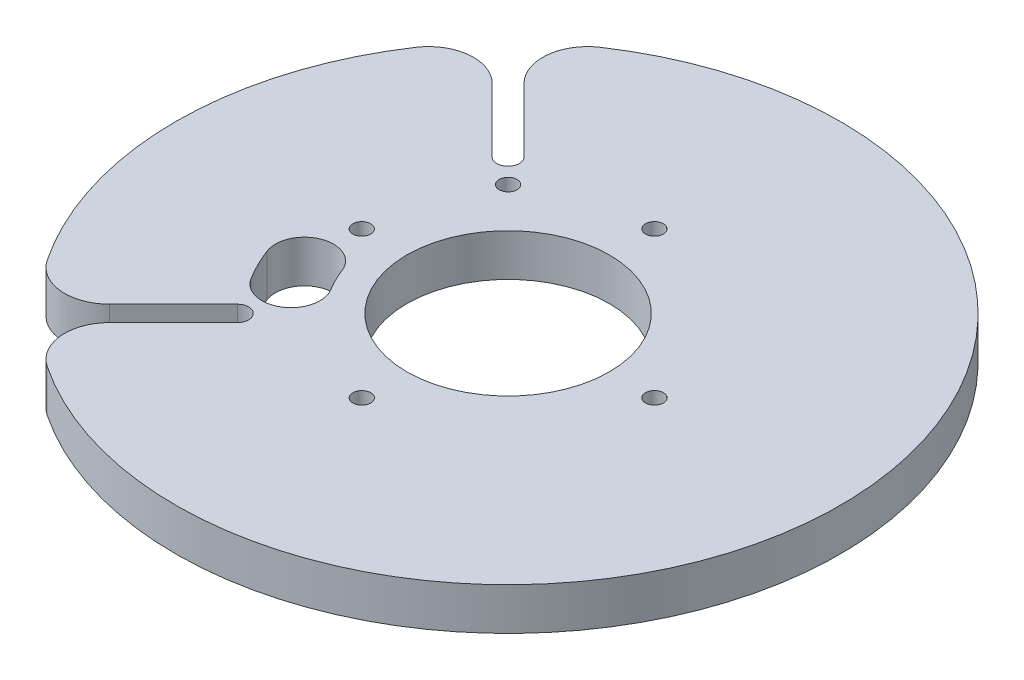
ISO-10303-21;
HEADER;
FILE_DESCRIPTION(('STEP AP214'),'2;1');
FILE_NAME('part.step','',(''),(''),'','','');
FILE_SCHEMA(('AUTOMOTIVE_DESIGN { 1 0 10303 214 1 1 1 1 }'));
ENDSEC;
DATA;
#1=APPLICATION_CONTEXT('core data for automotive mechanical design processes');
#2=APPLICATION_PROTOCOL_DEFINITION('international standard','automotive_design',2000,#1);
#3=PRODUCT_CONTEXT('',#1,'mechanical');
#4=PRODUCT('Part','Part','',(#3));
#5=PRODUCT_RELATED_PRODUCT_CATEGORY('part','',(#4));
#6=PRODUCT_DEFINITION_FORMATION('','',#4);
#7=PRODUCT_DEFINITION_CONTEXT('part definition',#1,'design');
#8=PRODUCT_DEFINITION('design','',#6,#7);
#9=PRODUCT_DEFINITION_SHAPE('','',#8);
#10=(LENGTH_UNIT() NAMED_UNIT(*) SI_UNIT(.MILLI.,.METRE.));
#11=(NAMED_UNIT(*) PLANE_ANGLE_UNIT() SI_UNIT($,.RADIAN.));
#12=(NAMED_UNIT(*) SI_UNIT($,.STERADIAN.) SOLID_ANGLE_UNIT());
#13=UNCERTAINTY_MEASURE_WITH_UNIT(LENGTH_MEASURE(1.E-05),#10,'distance_accuracy_value','');
#14=(GEOMETRIC_REPRESENTATION_CONTEXT(3) GLOBAL_UNCERTAINTY_ASSIGNED_CONTEXT((#13)) GLOBAL_UNIT_ASSIGNED_CONTEXT((#10,
#11,#12)) REPRESENTATION_CONTEXT('',''));
#15=CARTESIAN_POINT('',(0.,0.,0.));
#16=DIRECTION('',(0.,0.,1.));
#17=DIRECTION('',(1.,0.,0.));
#18=AXIS2_PLACEMENT_3D('',#15,#16,#17);
#19=CARTESIAN_POINT('',(0.,9.525,0.));
#20=DIRECTION('',(0.,-1.,0.));
#21=DIRECTION('',(0.,0.,-1.));
#22=AXIS2_PLACEMENT_3D('',#19,#20,#21);
#23=CYLINDRICAL_SURFACE('',#22,75.);
#24=CARTESIAN_POINT('',(0.,9.525,0.));
#25=DIRECTION('',(0.,1.,0.));
#26=DIRECTION('',(0.,0.,1.));
#27=AXIS2_PLACEMENT_3D('',#24,#25,#26);
#28=CIRCLE('',#27,75.);
#29=CARTESIAN_POINT('',(-41.6183838096098,9.525,62.393189765198));
#30=VERTEX_POINT('',#29);
#31=CARTESIAN_POINT('',(-41.6183838096098,9.525,-62.393189765198));
#32=VERTEX_POINT('',#31);
#33=EDGE_CURVE('E263',#30,#32,#28,.T.);
#34=ORIENTED_EDGE('',*,*,#33,.F.);
#35=DIRECTION('',(0.,-1.,0.));
#36=VECTOR('',#35,1.);
#37=CARTESIAN_POINT('',(-41.6183838096098,9.525,62.393189765198));
#38=LINE('',#37,#36);
#39=CARTESIAN_POINT('',(-41.6183838096098,0.,62.393189765198));
#40=VERTEX_POINT('',#39);
#41=EDGE_CURVE('E280',#30,#40,#38,.T.);
#42=ORIENTED_EDGE('',*,*,#41,.T.);
#43=CARTESIAN_POINT('',(0.,0.,0.));
#44=DIRECTION('',(0.,1.,0.));
#45=DIRECTION('',(0.,0.,1.));
#46=AXIS2_PLACEMENT_3D('',#43,#44,#45);
#47=CIRCLE('',#46,75.);
#48=CARTESIAN_POINT('',(-41.6183838096098,0.,-62.393189765198));
#49=VERTEX_POINT('',#48);
#50=EDGE_CURVE('E258',#40,#49,#47,.T.);
#51=ORIENTED_EDGE('',*,*,#50,.T.);
#52=DIRECTION('',(0.,-1.,0.));
#53=VECTOR('',#52,1.);
#54=CARTESIAN_POINT('',(-41.6183838096098,9.525,-62.393189765198));
#55=LINE('',#54,#53);
#56=EDGE_CURVE('E277',#49,#32,#55,.F.);
#57=ORIENTED_EDGE('',*,*,#56,.T.);
#58=EDGE_LOOP('',(#34,#42,#51,#57));
#59=FACE_BOUND('',#58,.T.);
#60=ADVANCED_FACE('F33',(#59),#23,.T.);
#61=CARTESIAN_POINT('',(-62.3931897651984,0.,-41.6183838096091));
#62=VERTEX_POINT('',#61);
#63=CARTESIAN_POINT('',(-62.3931897651984,0.,41.6183838096092));
#64=VERTEX_POINT('',#63);
#65=EDGE_CURVE('E264',#62,#64,#47,.T.);
#66=ORIENTED_EDGE('',*,*,#65,.T.);
#67=DIRECTION('',(0.,-1.,0.));
#68=VECTOR('',#67,1.);
#69=CARTESIAN_POINT('',(-62.3931897651984,9.525,41.6183838096092));
#70=LINE('',#69,#68);
#71=CARTESIAN_POINT('',(-62.3931897651984,9.525,41.6183838096092));
#72=VERTEX_POINT('',#71);
#73=EDGE_CURVE('E292',#64,#72,#70,.F.);
#74=ORIENTED_EDGE('',*,*,#73,.T.);
#75=CARTESIAN_POINT('',(-62.3931897651984,9.525,-41.6183838096091));
#76=VERTEX_POINT('',#75);
#77=EDGE_CURVE('E259',#76,#72,#28,.T.);
#78=ORIENTED_EDGE('',*,*,#77,.F.);
#79=DIRECTION('',(0.,-1.,0.));
#80=VECTOR('',#79,1.);
#81=CARTESIAN_POINT('',(-62.3931897651984,9.525,-41.6183838096091));
#82=LINE('',#81,#80);
#83=EDGE_CURVE('E290',#76,#62,#82,.T.);
#84=ORIENTED_EDGE('',*,*,#83,.T.);
#85=EDGE_LOOP('',(#66,#74,#78,#84));
#86=FACE_BOUND('',#85,.T.);
#87=ADVANCED_FACE('F322',(#86),#23,.T.);
#88=CARTESIAN_POINT('',(0.,9.525,0.));
#89=DIRECTION('',(0.,1.,0.));
#90=DIRECTION('',(0.,0.,1.));
#91=AXIS2_PLACEMENT_3D('',#88,#89,#90);
#92=PLANE('',#91);
#93=CARTESIAN_POINT('',(-33.242514605961,9.52499999999999,12.7030765646133));
#94=DIRECTION('',(0.,1.,0.));
#95=DIRECTION('',(0.,0.,1.));
#96=AXIS2_PLACEMENT_3D('',#93,#94,#95);
#97=CIRCLE('',#96,6.55197639919967);
#98=CARTESIAN_POINT('',(-27.1221810022313,9.52499999999999,10.3642924115272));
#99=VERTEX_POINT('',#98);
#100=CARTESIAN_POINT('',(-39.3628482096907,9.525,15.0418607176993));
#101=VERTEX_POINT('',#100);
#102=EDGE_CURVE('E48',#99,#101,#97,.T.);
#103=ORIENTED_EDGE('',*,*,#102,.F.);
#104=CARTESIAN_POINT('',(0.,9.52499999999999,0.));
#105=DIRECTION('',(0.,-1.,0.));
#106=DIRECTION('',(0.,0.,1.));
#107=AXIS2_PLACEMENT_3D('',#104,#105,#106);
#108=CIRCLE('',#107,29.0350005942731);
#109=CARTESIAN_POINT('',(-24.6777747972826,9.52499999999999,15.2983231291551));
#110=VERTEX_POINT('',#109);
#111=EDGE_CURVE('E163',#110,#99,#108,.T.);
#112=ORIENTED_EDGE('',*,*,#111,.F.);
#113=CARTESIAN_POINT('',(-30.2465089025766,9.52499999999999,18.7505101461351));
#114=DIRECTION('',(0.,1.,0.));
#115=DIRECTION('',(0.,0.,1.));
#116=AXIS2_PLACEMENT_3D('',#113,#114,#115);
#117=CIRCLE('',#116,6.55197639919968);
#118=CARTESIAN_POINT('',(-35.8152430078706,9.52499999999999,22.202697163115));
#119=VERTEX_POINT('',#118);
#120=EDGE_CURVE('E166',#119,#110,#117,.T.);
#121=ORIENTED_EDGE('',*,*,#120,.F.);
#122=CARTESIAN_POINT('',(0.,9.52499999999999,0.));
#123=DIRECTION('',(0.,1.,0.));
#124=DIRECTION('',(0.,0.,1.));
#125=AXIS2_PLACEMENT_3D('',#122,#123,#124);
#126=CIRCLE('',#125,42.1389533926724);
#127=EDGE_CURVE('E172',#101,#119,#126,.T.);
#128=ORIENTED_EDGE('',*,*,#127,.F.);
#129=EDGE_LOOP('',(#103,#112,#121,#128));
#130=FACE_BOUND('',#129,.T.);
#131=CARTESIAN_POINT('',(-25.1637927540144,9.52499999999999,-25.1637927540141));
#132=DIRECTION('',(0.,1.,0.));
#133=DIRECTION('',(0.,0.,1.));
#134=AXIS2_PLACEMENT_3D('',#131,#132,#133);
#135=CIRCLE('',#134,2.0193);
#136=CARTESIAN_POINT('',(-25.1637927540144,9.52499999999999,-23.1444927540141));
#137=VERTEX_POINT('',#136);
#138=EDGE_CURVE('E178',#137,#137,#135,.T.);
#139=ORIENTED_EDGE('',*,*,#138,.F.);
#140=EDGE_LOOP('',(#139));
#141=FACE_BOUND('',#140,.T.);
#142=CARTESIAN_POINT('',(-33.0199999999991,9.52499999999999,5.68989300120393E-13));
#143=DIRECTION('',(0.,1.,0.));
#144=DIRECTION('',(0.,0.,1.));
#145=AXIS2_PLACEMENT_3D('',#142,#143,#144);
#146=CIRCLE('',#145,2.0193);
#147=CARTESIAN_POINT('',(-33.0199999999991,9.52499999999999,2.01930000000057));
#148=VERTEX_POINT('',#147);
#149=EDGE_CURVE('E185',#148,#148,#146,.T.);
#150=ORIENTED_EDGE('',*,*,#149,.F.);
#151=EDGE_LOOP('',(#150));
#152=FACE_BOUND('',#151,.T.);
#153=CARTESIAN_POINT('',(1.63757896132211E-12,9.52499999999999,33.02));
#154=DIRECTION('',(0.,1.,0.));
#155=DIRECTION('',(0.,0.,1.));
#156=AXIS2_PLACEMENT_3D('',#153,#154,#155);
#157=CIRCLE('',#156,2.0193);
#158=CARTESIAN_POINT('',(1.63757896132211E-12,9.52499999999999,35.0393));
#159=VERTEX_POINT('',#158);
#160=EDGE_CURVE('E191',#159,#159,#157,.T.);
#161=ORIENTED_EDGE('',*,*,#160,.F.);
#162=EDGE_LOOP('',(#161));
#163=FACE_BOUND('',#162,.T.);
#164=CARTESIAN_POINT('',(33.0200000000009,9.52499999999999,-8.32667268468867E-13));
#165=DIRECTION('',(0.,1.,0.));
#166=DIRECTION('',(0.,0.,1.));
#167=AXIS2_PLACEMENT_3D('',#164,#165,#166);
#168=CIRCLE('',#167,2.01930000000001);
#169=CARTESIAN_POINT('',(33.0200000000009,9.52499999999999,2.01929999999917));
#170=VERTEX_POINT('',#169);
#171=EDGE_CURVE('E197',#170,#170,#168,.T.);
#172=ORIENTED_EDGE('',*,*,#171,.F.);
#173=EDGE_LOOP('',(#172));
#174=FACE_BOUND('',#173,.T.);
#175=CARTESIAN_POINT('',(0.,9.52499999999999,-33.02));
#176=DIRECTION('',(0.,1.,0.));
#177=DIRECTION('',(0.,0.,1.));
#178=AXIS2_PLACEMENT_3D('',#175,#176,#177);
#179=CIRCLE('',#178,2.01930000000001);
#180=CARTESIAN_POINT('',(0.,9.52499999999999,-31.0007));
#181=VERTEX_POINT('',#180);
#182=EDGE_CURVE('E203',#181,#181,#179,.T.);
#183=ORIENTED_EDGE('',*,*,#182,.F.);
#184=EDGE_LOOP('',(#183));
#185=FACE_BOUND('',#184,.T.);
#186=CARTESIAN_POINT('',(0.,9.52499999999999,0.));
#187=DIRECTION('',(0.,1.,0.));
#188=DIRECTION('',(0.,0.,1.));
#189=AXIS2_PLACEMENT_3D('',#186,#187,#188);
#190=CIRCLE('',#189,22.86);
#191=CARTESIAN_POINT('',(0.,9.52499999999999,22.86));
#192=VERTEX_POINT('',#191);
#193=EDGE_CURVE('E209',#192,#192,#190,.T.);
#194=ORIENTED_EDGE('',*,*,#193,.F.);
#195=EDGE_LOOP('',(#194));
#196=FACE_BOUND('',#195,.T.);
#197=DIRECTION('',(0.707106781186551,0.,-0.707106781186544));
#198=VECTOR('',#197,1.);
#199=CARTESIAN_POINT('',(-51.2065355051151,9.525,54.7986379535422));
#200=LINE('',#199,#198);
#201=CARTESIAN_POINT('',(-43.1646849797233,9.525,46.7567874281505));
#202=VERTEX_POINT('',#201);
#203=CARTESIAN_POINT('',(-28.7558952024421,9.525,32.3479976508694));
#204=VERTEX_POINT('',#203);
#205=EDGE_CURVE('E229',#202,#204,#200,.T.);
#206=ORIENTED_EDGE('',*,*,#205,.F.);
#207=CARTESIAN_POINT('',(-35.980480082868,9.525,53.9409923250058));
#208=DIRECTION('',(0.,1.,0.));
#209=DIRECTION('',(0.,0.,1.));
#210=AXIS2_PLACEMENT_3D('',#207,#208,#209);
#211=CIRCLE('',#210,10.16);
#212=EDGE_CURVE('E275',#202,#30,#211,.T.);
#213=ORIENTED_EDGE('',*,*,#212,.T.);
#214=ORIENTED_EDGE('',*,*,#33,.T.);
#215=CARTESIAN_POINT('',(-35.980480082868,9.525,-53.9409923250058));
#216=DIRECTION('',(0.,1.,0.));
#217=DIRECTION('',(0.,0.,1.));
#218=AXIS2_PLACEMENT_3D('',#215,#216,#217);
#219=CIRCLE('',#218,10.16);
#220=CARTESIAN_POINT('',(-43.1646849797233,9.525,-46.7567874281505));
#221=VERTEX_POINT('',#220);
#222=EDGE_CURVE('E269',#32,#221,#219,.T.);
#223=ORIENTED_EDGE('',*,*,#222,.T.);
#224=DIRECTION('',(-0.707106781186551,0.,-0.707106781186544));
#225=VECTOR('',#224,1.);
#226=CARTESIAN_POINT('',(-51.2065355051151,9.525,-54.7986379535422));
#227=LINE('',#226,#225);
#228=CARTESIAN_POINT('',(-28.7558952024421,9.525,-32.3479976508694));
#229=VERTEX_POINT('',#228);
#230=EDGE_CURVE('E247',#229,#221,#227,.T.);
#231=ORIENTED_EDGE('',*,*,#230,.F.);
#232=CARTESIAN_POINT('',(-30.5519464266559,9.525,-30.5519464266555));
#233=DIRECTION('',(0.,1.,0.));
#234=DIRECTION('',(0.,0.,1.));
#235=AXIS2_PLACEMENT_3D('',#232,#233,#234);
#236=CIRCLE('',#235,2.54);
#237=CARTESIAN_POINT('',(-32.3479976508697,9.525,-28.7558952024417));
#238=VERTEX_POINT('',#237);
#239=EDGE_CURVE('E244',#238,#229,#236,.T.);
#240=ORIENTED_EDGE('',*,*,#239,.F.);
#241=DIRECTION('',(0.707106781186551,0.,0.707106781186543));
#242=VECTOR('',#241,1.);
#243=CARTESIAN_POINT('',(-54.7986379535427,9.525,-51.2065355051145));
#244=LINE('',#243,#242);
#245=CARTESIAN_POINT('',(-46.7567874281509,9.525,-43.1646849797228));
#246=VERTEX_POINT('',#245);
#247=EDGE_CURVE('E242',#246,#238,#244,.T.);
#248=ORIENTED_EDGE('',*,*,#247,.F.);
#249=CARTESIAN_POINT('',(-53.9409923250062,9.525,-35.9804800828674));
#250=DIRECTION('',(0.,1.,0.));
#251=DIRECTION('',(0.,0.,1.));
#252=AXIS2_PLACEMENT_3D('',#249,#250,#251);
#253=CIRCLE('',#252,10.16);
#254=EDGE_CURVE('E271',#246,#76,#253,.T.);
#255=ORIENTED_EDGE('',*,*,#254,.T.);
#256=ORIENTED_EDGE('',*,*,#77,.T.);
#257=CARTESIAN_POINT('',(-53.9409923250062,9.525,35.9804800828674));
#258=DIRECTION('',(0.,1.,0.));
#259=DIRECTION('',(0.,0.,1.));
#260=AXIS2_PLACEMENT_3D('',#257,#258,#259);
#261=CIRCLE('',#260,10.16);
#262=CARTESIAN_POINT('',(-46.7567874281509,9.525,43.1646849797228));
#263=VERTEX_POINT('',#262);
#264=EDGE_CURVE('E273',#72,#263,#261,.T.);
#265=ORIENTED_EDGE('',*,*,#264,.T.);
#266=DIRECTION('',(-0.707106781186551,0.,0.707106781186544));
#267=VECTOR('',#266,1.);
#268=CARTESIAN_POINT('',(-54.7986379535427,9.525,51.2065355051145));
#269=LINE('',#268,#267);
#270=CARTESIAN_POINT('',(-32.3479976508697,9.525,28.7558952024417));
#271=VERTEX_POINT('',#270);
#272=EDGE_CURVE('E226',#271,#263,#269,.T.);
#273=ORIENTED_EDGE('',*,*,#272,.F.);
#274=CARTESIAN_POINT('',(-30.5519464266559,9.525,30.5519464266555));
#275=DIRECTION('',(0.,1.,0.));
#276=DIRECTION('',(0.,0.,-1.));
#277=AXIS2_PLACEMENT_3D('',#274,#275,#276);
#278=CIRCLE('',#277,2.53999999999999);
#279=EDGE_CURVE('E223',#204,#271,#278,.T.);
#280=ORIENTED_EDGE('',*,*,#279,.F.);
#281=EDGE_LOOP('',(#206,#213,#214,#223,#231,#240,#248,#255,#256,#265,#273,#280));
#282=FACE_BOUND('',#281,.T.);
#283=ADVANCED_FACE('F308',(#130,#141,#152,#163,#174,#185,#196,#282),#92,.T.);
#284=CARTESIAN_POINT('',(0.,0.,0.));
#285=DIRECTION('',(0.,1.,0.));
#286=DIRECTION('',(0.,0.,1.));
#287=AXIS2_PLACEMENT_3D('',#284,#285,#286);
#288=PLANE('',#287);
#289=CARTESIAN_POINT('',(0.,0.,0.));
#290=DIRECTION('',(0.,-1.,0.));
#291=DIRECTION('',(0.,0.,1.));
#292=AXIS2_PLACEMENT_3D('',#289,#290,#291);
#293=CIRCLE('',#292,29.0350005942731);
#294=CARTESIAN_POINT('',(-24.6777747972826,0.,15.2983231291551));
#295=VERTEX_POINT('',#294);
#296=CARTESIAN_POINT('',(-27.1221810022313,0.,10.3642924115272));
#297=VERTEX_POINT('',#296);
#298=EDGE_CURVE('E153',#295,#297,#293,.T.);
#299=ORIENTED_EDGE('',*,*,#298,.T.);
#300=CARTESIAN_POINT('',(-33.242514605961,0.,12.7030765646133));
#301=DIRECTION('',(0.,1.,0.));
#302=DIRECTION('',(0.,0.,1.));
#303=AXIS2_PLACEMENT_3D('',#300,#301,#302);
#304=CIRCLE('',#303,6.55197639919967);
#305=CARTESIAN_POINT('',(-39.3628482096907,0.,15.0418607176993));
#306=VERTEX_POINT('',#305);
#307=EDGE_CURVE('E147',#297,#306,#304,.T.);
#308=ORIENTED_EDGE('',*,*,#307,.T.);
#309=CARTESIAN_POINT('',(0.,0.,0.));
#310=DIRECTION('',(0.,1.,0.));
#311=DIRECTION('',(0.,0.,1.));
#312=AXIS2_PLACEMENT_3D('',#309,#310,#311);
#313=CIRCLE('',#312,42.1389533926724);
#314=CARTESIAN_POINT('',(-35.8152430078706,0.,22.202697163115));
#315=VERTEX_POINT('',#314);
#316=EDGE_CURVE('E156',#306,#315,#313,.T.);
#317=ORIENTED_EDGE('',*,*,#316,.T.);
#318=CARTESIAN_POINT('',(-30.2465089025766,0.,18.7505101461351));
#319=DIRECTION('',(0.,1.,0.));
#320=DIRECTION('',(0.,0.,1.));
#321=AXIS2_PLACEMENT_3D('',#318,#319,#320);
#322=CIRCLE('',#321,6.55197639919968);
#323=EDGE_CURVE('E56',#315,#295,#322,.T.);
#324=ORIENTED_EDGE('',*,*,#323,.T.);
#325=EDGE_LOOP('',(#299,#308,#317,#324));
#326=FACE_BOUND('',#325,.T.);
#327=CARTESIAN_POINT('',(-25.1637927540144,0.,-25.1637927540141));
#328=DIRECTION('',(0.,1.,0.));
#329=DIRECTION('',(0.,0.,1.));
#330=AXIS2_PLACEMENT_3D('',#327,#328,#329);
#331=CIRCLE('',#330,2.0193);
#332=CARTESIAN_POINT('',(-25.1637927540144,0.,-23.1444927540141));
#333=VERTEX_POINT('',#332);
#334=EDGE_CURVE('E182',#333,#333,#331,.T.);
#335=ORIENTED_EDGE('',*,*,#334,.T.);
#336=EDGE_LOOP('',(#335));
#337=FACE_BOUND('',#336,.T.);
#338=CARTESIAN_POINT('',(-33.0199999999991,0.,5.68989300120393E-13));
#339=DIRECTION('',(0.,1.,0.));
#340=DIRECTION('',(0.,0.,1.));
#341=AXIS2_PLACEMENT_3D('',#338,#339,#340);
#342=CIRCLE('',#341,2.0193);
#343=CARTESIAN_POINT('',(-33.0199999999991,0.,2.01930000000057));
#344=VERTEX_POINT('',#343);
#345=EDGE_CURVE('E188',#344,#344,#342,.T.);
#346=ORIENTED_EDGE('',*,*,#345,.T.);
#347=EDGE_LOOP('',(#346));
#348=FACE_BOUND('',#347,.T.);
#349=CARTESIAN_POINT('',(1.63757896132211E-12,0.,33.02));
#350=DIRECTION('',(0.,1.,0.));
#351=DIRECTION('',(0.,0.,1.));
#352=AXIS2_PLACEMENT_3D('',#349,#350,#351);
#353=CIRCLE('',#352,2.0193);
#354=CARTESIAN_POINT('',(1.63757896132211E-12,0.,35.0393));
#355=VERTEX_POINT('',#354);
#356=EDGE_CURVE('E194',#355,#355,#353,.T.);
#357=ORIENTED_EDGE('',*,*,#356,.T.);
#358=EDGE_LOOP('',(#357));
#359=FACE_BOUND('',#358,.T.);
#360=CARTESIAN_POINT('',(33.0200000000009,0.,-8.32667268468867E-13));
#361=DIRECTION('',(0.,1.,0.));
#362=DIRECTION('',(0.,0.,1.));
#363=AXIS2_PLACEMENT_3D('',#360,#361,#362);
#364=CIRCLE('',#363,2.01930000000001);
#365=CARTESIAN_POINT('',(33.0200000000009,0.,2.01929999999917));
#366=VERTEX_POINT('',#365);
#367=EDGE_CURVE('E200',#366,#366,#364,.T.);
#368=ORIENTED_EDGE('',*,*,#367,.T.);
#369=EDGE_LOOP('',(#368));
#370=FACE_BOUND('',#369,.T.);
#371=CARTESIAN_POINT('',(0.,0.,-33.02));
#372=DIRECTION('',(0.,1.,0.));
#373=DIRECTION('',(0.,0.,1.));
#374=AXIS2_PLACEMENT_3D('',#371,#372,#373);
#375=CIRCLE('',#374,2.01930000000001);
#376=CARTESIAN_POINT('',(0.,0.,-31.0007));
#377=VERTEX_POINT('',#376);
#378=EDGE_CURVE('E206',#377,#377,#375,.T.);
#379=ORIENTED_EDGE('',*,*,#378,.T.);
#380=EDGE_LOOP('',(#379));
#381=FACE_BOUND('',#380,.T.);
#382=CARTESIAN_POINT('',(0.,0.,0.));
#383=DIRECTION('',(0.,1.,0.));
#384=DIRECTION('',(0.,0.,1.));
#385=AXIS2_PLACEMENT_3D('',#382,#383,#384);
#386=CIRCLE('',#385,22.86);
#387=CARTESIAN_POINT('',(0.,0.,22.86));
#388=VERTEX_POINT('',#387);
#389=EDGE_CURVE('E212',#388,#388,#386,.T.);
#390=ORIENTED_EDGE('',*,*,#389,.T.);
#391=EDGE_LOOP('',(#390));
#392=FACE_BOUND('',#391,.T.);
#393=ORIENTED_EDGE('',*,*,#50,.F.);
#394=CARTESIAN_POINT('',(-35.980480082868,0.,53.9409923250058));
#395=DIRECTION('',(0.,1.,0.));
#396=DIRECTION('',(0.,0.,1.));
#397=AXIS2_PLACEMENT_3D('',#394,#395,#396);
#398=CIRCLE('',#397,10.16);
#399=CARTESIAN_POINT('',(-43.1646849797233,0.,46.7567874281505));
#400=VERTEX_POINT('',#399);
#401=EDGE_CURVE('E288',#40,#400,#398,.F.);
#402=ORIENTED_EDGE('',*,*,#401,.T.);
#403=DIRECTION('',(-0.707106781186551,0.,0.707106781186544));
#404=VECTOR('',#403,1.);
#405=CARTESIAN_POINT('',(-51.2065355051151,0.,54.7986379535422));
#406=LINE('',#405,#404);
#407=CARTESIAN_POINT('',(-28.7558952024421,0.,32.3479976508694));
#408=VERTEX_POINT('',#407);
#409=EDGE_CURVE('E220',#408,#400,#406,.T.);
#410=ORIENTED_EDGE('',*,*,#409,.F.);
#411=CARTESIAN_POINT('',(-30.5519464266559,0.,30.5519464266555));
#412=DIRECTION('',(0.,1.,0.));
#413=DIRECTION('',(0.,0.,1.));
#414=AXIS2_PLACEMENT_3D('',#411,#412,#413);
#415=CIRCLE('',#414,2.53999999999999);
#416=CARTESIAN_POINT('',(-32.3479976508697,0.,28.7558952024417));
#417=VERTEX_POINT('',#416);
#418=EDGE_CURVE('E215',#417,#408,#415,.F.);
#419=ORIENTED_EDGE('',*,*,#418,.F.);
#420=DIRECTION('',(0.707106781186551,0.,-0.707106781186544));
#421=VECTOR('',#420,1.);
#422=CARTESIAN_POINT('',(-54.7986379535427,0.,51.2065355051145));
#423=LINE('',#422,#421);
#424=CARTESIAN_POINT('',(-46.7567874281509,0.,43.1646849797228));
#425=VERTEX_POINT('',#424);
#426=EDGE_CURVE('E235',#425,#417,#423,.T.);
#427=ORIENTED_EDGE('',*,*,#426,.F.);
#428=CARTESIAN_POINT('',(-53.9409923250062,0.,35.9804800828674));
#429=DIRECTION('',(0.,1.,0.));
#430=DIRECTION('',(0.,0.,1.));
#431=AXIS2_PLACEMENT_3D('',#428,#429,#430);
#432=CIRCLE('',#431,10.16);
#433=EDGE_CURVE('E286',#425,#64,#432,.F.);
#434=ORIENTED_EDGE('',*,*,#433,.T.);
#435=ORIENTED_EDGE('',*,*,#65,.F.);
#436=CARTESIAN_POINT('',(-53.9409923250062,0.,-35.9804800828674));
#437=DIRECTION('',(0.,1.,0.));
#438=DIRECTION('',(0.,0.,1.));
#439=AXIS2_PLACEMENT_3D('',#436,#437,#438);
#440=CIRCLE('',#439,10.16);
#441=CARTESIAN_POINT('',(-46.7567874281509,0.,-43.1646849797228));
#442=VERTEX_POINT('',#441);
#443=EDGE_CURVE('E284',#62,#442,#440,.F.);
#444=ORIENTED_EDGE('',*,*,#443,.T.);
#445=DIRECTION('',(-0.707106781186551,0.,-0.707106781186544));
#446=VECTOR('',#445,1.);
#447=CARTESIAN_POINT('',(-54.7986379535427,0.,-51.2065355051145));
#448=LINE('',#447,#446);
#449=CARTESIAN_POINT('',(-32.3479976508697,0.,-28.7558952024417));
#450=VERTEX_POINT('',#449);
#451=EDGE_CURVE('E253',#450,#442,#448,.T.);
#452=ORIENTED_EDGE('',*,*,#451,.F.);
#453=CARTESIAN_POINT('',(-30.5519464266559,0.,-30.5519464266555));
#454=DIRECTION('',(0.,1.,0.));
#455=DIRECTION('',(0.,0.,1.));
#456=AXIS2_PLACEMENT_3D('',#453,#454,#455);
#457=CIRCLE('',#456,2.54);
#458=CARTESIAN_POINT('',(-28.7558952024421,0.,-32.3479976508694));
#459=VERTEX_POINT('',#458);
#460=EDGE_CURVE('E238',#459,#450,#457,.F.);
#461=ORIENTED_EDGE('',*,*,#460,.F.);
#462=DIRECTION('',(0.707106781186551,0.,0.707106781186544));
#463=VECTOR('',#462,1.);
#464=CARTESIAN_POINT('',(-51.2065355051151,0.,-54.7986379535422));
#465=LINE('',#464,#463);
#466=CARTESIAN_POINT('',(-43.1646849797233,0.,-46.7567874281505));
#467=VERTEX_POINT('',#466);
#468=EDGE_CURVE('E240',#467,#459,#465,.T.);
#469=ORIENTED_EDGE('',*,*,#468,.F.);
#470=CARTESIAN_POINT('',(-35.980480082868,0.,-53.9409923250058));
#471=DIRECTION('',(0.,1.,0.));
#472=DIRECTION('',(0.,0.,1.));
#473=AXIS2_PLACEMENT_3D('',#470,#471,#472);
#474=CIRCLE('',#473,10.16);
#475=EDGE_CURVE('E282',#467,#49,#474,.F.);
#476=ORIENTED_EDGE('',*,*,#475,.T.);
#477=EDGE_LOOP('',(#393,#402,#410,#419,#427,#434,#435,#444,#452,#461,#469,#476));
#478=FACE_BOUND('',#477,.T.);
#479=ADVANCED_FACE('F160',(#326,#337,#348,#359,#370,#381,#392,#478),#288,.F.);
#480=CARTESIAN_POINT('',(-51.2065355051151,-0.000999999999999265,-54.7986379535422));
#481=DIRECTION('',(0.707106781186544,0.,-0.707106781186551));
#482=DIRECTION('',(-0.707106781186551,0.,-0.707106781186544));
#483=AXIS2_PLACEMENT_3D('',#480,#481,#482);
#484=PLANE('',#483);
#485=ORIENTED_EDGE('',*,*,#230,.T.);
#486=DIRECTION('',(0.,-1.,0.));
#487=VECTOR('',#486,1.);
#488=CARTESIAN_POINT('',(-43.1646849797233,-0.000999999999999265,-46.7567874281505));
#489=LINE('',#488,#487);
#490=EDGE_CURVE('E11',#221,#467,#489,.T.);
#491=ORIENTED_EDGE('',*,*,#490,.T.);
#492=ORIENTED_EDGE('',*,*,#468,.T.);
#493=DIRECTION('',(0.,1.,0.));
#494=VECTOR('',#493,1.);
#495=CARTESIAN_POINT('',(-28.7558952024421,-0.000999999999999265,-32.3479976508694));
#496=LINE('',#495,#494);
#497=EDGE_CURVE('E251',#459,#229,#496,.T.);
#498=ORIENTED_EDGE('',*,*,#497,.T.);
#499=EDGE_LOOP('',(#485,#491,#492,#498));
#500=FACE_BOUND('',#499,.T.);
#501=ADVANCED_FACE('F354',(#500),#484,.F.);
#502=CARTESIAN_POINT('',(-30.5519464266559,-0.000999999999999265,-30.5519464266555));
#503=DIRECTION('',(0.,1.,0.));
#504=DIRECTION('',(0.,0.,1.));
#505=AXIS2_PLACEMENT_3D('',#502,#503,#504);
#506=CYLINDRICAL_SURFACE('',#505,2.54);
#507=ORIENTED_EDGE('',*,*,#460,.T.);
#508=DIRECTION('',(0.,1.,0.));
#509=VECTOR('',#508,1.);
#510=CARTESIAN_POINT('',(-32.3479976508697,-0.000999999999999265,-28.7558952024417));
#511=LINE('',#510,#509);
#512=EDGE_CURVE('E250',#450,#238,#511,.T.);
#513=ORIENTED_EDGE('',*,*,#512,.T.);
#514=ORIENTED_EDGE('',*,*,#239,.T.);
#515=ORIENTED_EDGE('',*,*,#497,.F.);
#516=EDGE_LOOP('',(#507,#513,#514,#515));
#517=FACE_BOUND('',#516,.T.);
#518=ADVANCED_FACE('F313',(#517),#506,.F.);
#519=CARTESIAN_POINT('',(-54.7986379535427,-0.000999999999999265,-51.2065355051145));
#520=DIRECTION('',(-0.707106781186544,0.,0.707106781186551));
#521=DIRECTION('',(0.707106781186551,0.,0.707106781186544));
#522=AXIS2_PLACEMENT_3D('',#519,#520,#521);
#523=PLANE('',#522);
#524=ORIENTED_EDGE('',*,*,#451,.T.);
#525=DIRECTION('',(0.,-1.,0.));
#526=VECTOR('',#525,1.);
#527=CARTESIAN_POINT('',(-46.7567874281509,-0.000999999999999265,-43.1646849797228));
#528=LINE('',#527,#526);
#529=EDGE_CURVE('E41',#442,#246,#528,.F.);
#530=ORIENTED_EDGE('',*,*,#529,.T.);
#531=ORIENTED_EDGE('',*,*,#247,.T.);
#532=ORIENTED_EDGE('',*,*,#512,.F.);
#533=EDGE_LOOP('',(#524,#530,#531,#532));
#534=FACE_BOUND('',#533,.T.);
#535=ADVANCED_FACE('F300',(#534),#523,.F.);
#536=CARTESIAN_POINT('',(-30.5519464266559,-0.000999999999999265,30.5519464266555));
#537=DIRECTION('',(0.,1.,0.));
#538=DIRECTION('',(0.,0.,1.));
#539=AXIS2_PLACEMENT_3D('',#536,#537,#538);
#540=CYLINDRICAL_SURFACE('',#539,2.53999999999999);
#541=ORIENTED_EDGE('',*,*,#418,.T.);
#542=DIRECTION('',(0.,1.,0.));
#543=VECTOR('',#542,1.);
#544=CARTESIAN_POINT('',(-28.7558952024421,-0.000999999999999265,32.3479976508694));
#545=LINE('',#544,#543);
#546=EDGE_CURVE('E232',#408,#204,#545,.T.);
#547=ORIENTED_EDGE('',*,*,#546,.T.);
#548=ORIENTED_EDGE('',*,*,#279,.T.);
#549=DIRECTION('',(0.,1.,0.));
#550=VECTOR('',#549,1.);
#551=CARTESIAN_POINT('',(-32.3479976508697,-0.000999999999999265,28.7558952024417));
#552=LINE('',#551,#550);
#553=EDGE_CURVE('E231',#417,#271,#552,.T.);
#554=ORIENTED_EDGE('',*,*,#553,.F.);
#555=EDGE_LOOP('',(#541,#547,#548,#554));
#556=FACE_BOUND('',#555,.T.);
#557=ADVANCED_FACE('F337',(#556),#540,.F.);
#558=CARTESIAN_POINT('',(-51.2065355051151,-0.000999999999999265,54.7986379535422));
#559=DIRECTION('',(0.707106781186544,0.,0.707106781186551));
#560=DIRECTION('',(0.707106781186551,0.,-0.707106781186544));
#561=AXIS2_PLACEMENT_3D('',#558,#559,#560);
#562=PLANE('',#561);
#563=ORIENTED_EDGE('',*,*,#409,.T.);
#564=DIRECTION('',(0.,-1.,0.));
#565=VECTOR('',#564,1.);
#566=CARTESIAN_POINT('',(-43.1646849797233,-0.000999999999999265,46.7567874281505));
#567=LINE('',#566,#565);
#568=EDGE_CURVE('E262',#400,#202,#567,.F.);
#569=ORIENTED_EDGE('',*,*,#568,.T.);
#570=ORIENTED_EDGE('',*,*,#205,.T.);
#571=ORIENTED_EDGE('',*,*,#546,.F.);
#572=EDGE_LOOP('',(#563,#569,#570,#571));
#573=FACE_BOUND('',#572,.T.);
#574=ADVANCED_FACE('F341',(#573),#562,.F.);
#575=CARTESIAN_POINT('',(-54.7986379535427,-0.000999999999999265,51.2065355051145));
#576=DIRECTION('',(-0.707106781186544,0.,-0.707106781186551));
#577=DIRECTION('',(-0.707106781186551,0.,0.707106781186544));
#578=AXIS2_PLACEMENT_3D('',#575,#576,#577);
#579=PLANE('',#578);
#580=ORIENTED_EDGE('',*,*,#272,.T.);
#581=DIRECTION('',(0.,-1.,0.));
#582=VECTOR('',#581,1.);
#583=CARTESIAN_POINT('',(-46.7567874281509,-0.000999999999999265,43.1646849797228));
#584=LINE('',#583,#582);
#585=EDGE_CURVE('E295',#263,#425,#584,.T.);
#586=ORIENTED_EDGE('',*,*,#585,.T.);
#587=ORIENTED_EDGE('',*,*,#426,.T.);
#588=ORIENTED_EDGE('',*,*,#553,.T.);
#589=EDGE_LOOP('',(#580,#586,#587,#588));
#590=FACE_BOUND('',#589,.T.);
#591=ADVANCED_FACE('F329',(#590),#579,.F.);
#592=CARTESIAN_POINT('',(-35.980480082868,9.525,53.9409923250058));
#593=DIRECTION('',(0.,-1.,0.));
#594=DIRECTION('',(0.,0.,-1.));
#595=AXIS2_PLACEMENT_3D('',#592,#593,#594);
#596=CYLINDRICAL_SURFACE('',#595,10.16);
#597=ORIENTED_EDGE('',*,*,#401,.F.);
#598=ORIENTED_EDGE('',*,*,#41,.F.);
#599=ORIENTED_EDGE('',*,*,#212,.F.);
#600=ORIENTED_EDGE('',*,*,#568,.F.);
#601=EDGE_LOOP('',(#597,#598,#599,#600));
#602=FACE_BOUND('',#601,.T.);
#603=ADVANCED_FACE('F345',(#602),#596,.T.);
#604=CARTESIAN_POINT('',(-53.9409923250062,9.525,35.9804800828674));
#605=DIRECTION('',(0.,-1.,0.));
#606=DIRECTION('',(0.,0.,-1.));
#607=AXIS2_PLACEMENT_3D('',#604,#605,#606);
#608=CYLINDRICAL_SURFACE('',#607,10.16);
#609=ORIENTED_EDGE('',*,*,#433,.F.);
#610=ORIENTED_EDGE('',*,*,#585,.F.);
#611=ORIENTED_EDGE('',*,*,#264,.F.);
#612=ORIENTED_EDGE('',*,*,#73,.F.);
#613=EDGE_LOOP('',(#609,#610,#611,#612));
#614=FACE_BOUND('',#613,.T.);
#615=ADVANCED_FACE('F333',(#614),#608,.T.);
#616=CARTESIAN_POINT('',(-53.9409923250062,9.525,-35.9804800828674));
#617=DIRECTION('',(0.,-1.,0.));
#618=DIRECTION('',(0.,0.,-1.));
#619=AXIS2_PLACEMENT_3D('',#616,#617,#618);
#620=CYLINDRICAL_SURFACE('',#619,10.16);
#621=ORIENTED_EDGE('',*,*,#443,.F.);
#622=ORIENTED_EDGE('',*,*,#83,.F.);
#623=ORIENTED_EDGE('',*,*,#254,.F.);
#624=ORIENTED_EDGE('',*,*,#529,.F.);
#625=EDGE_LOOP('',(#621,#622,#623,#624));
#626=FACE_BOUND('',#625,.T.);
#627=ADVANCED_FACE('F320',(#626),#620,.T.);
#628=CARTESIAN_POINT('',(-35.980480082868,9.525,-53.9409923250058));
#629=DIRECTION('',(0.,-1.,0.));
#630=DIRECTION('',(0.,0.,-1.));
#631=AXIS2_PLACEMENT_3D('',#628,#629,#630);
#632=CYLINDRICAL_SURFACE('',#631,10.16);
#633=ORIENTED_EDGE('',*,*,#475,.F.);
#634=ORIENTED_EDGE('',*,*,#490,.F.);
#635=ORIENTED_EDGE('',*,*,#222,.F.);
#636=ORIENTED_EDGE('',*,*,#56,.F.);
#637=EDGE_LOOP('',(#633,#634,#635,#636));
#638=FACE_BOUND('',#637,.T.);
#639=ADVANCED_FACE('F35',(#638),#632,.T.);
#640=CARTESIAN_POINT('',(0.,0.,0.));
#641=DIRECTION('',(0.,1.,0.));
#642=DIRECTION('',(0.,0.,1.));
#643=AXIS2_PLACEMENT_3D('',#640,#641,#642);
#644=CYLINDRICAL_SURFACE('',#643,22.86);
#645=ORIENTED_EDGE('',*,*,#389,.F.);
#646=EDGE_LOOP('',(#645));
#647=FACE_BOUND('',#646,.T.);
#648=ORIENTED_EDGE('',*,*,#193,.T.);
#649=EDGE_LOOP('',(#648));
#650=FACE_BOUND('',#649,.T.);
#651=ADVANCED_FACE('F378',(#647,#650),#644,.F.);
#652=CARTESIAN_POINT('',(0.,0.,-33.02));
#653=DIRECTION('',(0.,1.,0.));
#654=DIRECTION('',(0.,0.,1.));
#655=AXIS2_PLACEMENT_3D('',#652,#653,#654);
#656=CYLINDRICAL_SURFACE('',#655,2.01930000000001);
#657=ORIENTED_EDGE('',*,*,#378,.F.);
#658=EDGE_LOOP('',(#657));
#659=FACE_BOUND('',#658,.T.);
#660=ORIENTED_EDGE('',*,*,#182,.T.);
#661=EDGE_LOOP('',(#660));
#662=FACE_BOUND('',#661,.T.);
#663=ADVANCED_FACE('F382',(#659,#662),#656,.F.);
#664=CARTESIAN_POINT('',(33.0200000000009,0.,-8.32667268468867E-13));
#665=DIRECTION('',(0.,1.,0.));
#666=DIRECTION('',(0.,0.,1.));
#667=AXIS2_PLACEMENT_3D('',#664,#665,#666);
#668=CYLINDRICAL_SURFACE('',#667,2.01930000000001);
#669=ORIENTED_EDGE('',*,*,#367,.F.);
#670=EDGE_LOOP('',(#669));
#671=FACE_BOUND('',#670,.T.);
#672=ORIENTED_EDGE('',*,*,#171,.T.);
#673=EDGE_LOOP('',(#672));
#674=FACE_BOUND('',#673,.T.);
#675=ADVANCED_FACE('F388',(#671,#674),#668,.F.);
#676=CARTESIAN_POINT('',(1.63757896132211E-12,0.,33.02));
#677=DIRECTION('',(0.,1.,0.));
#678=DIRECTION('',(0.,0.,1.));
#679=AXIS2_PLACEMENT_3D('',#676,#677,#678);
#680=CYLINDRICAL_SURFACE('',#679,2.0193);
#681=ORIENTED_EDGE('',*,*,#356,.F.);
#682=EDGE_LOOP('',(#681));
#683=FACE_BOUND('',#682,.T.);
#684=ORIENTED_EDGE('',*,*,#160,.T.);
#685=EDGE_LOOP('',(#684));
#686=FACE_BOUND('',#685,.T.);
#687=ADVANCED_FACE('F425',(#683,#686),#680,.F.);
#688=CARTESIAN_POINT('',(-33.0199999999991,0.,5.68989300120393E-13));
#689=DIRECTION('',(0.,1.,0.));
#690=DIRECTION('',(0.,0.,1.));
#691=AXIS2_PLACEMENT_3D('',#688,#689,#690);
#692=CYLINDRICAL_SURFACE('',#691,2.0193);
#693=ORIENTED_EDGE('',*,*,#345,.F.);
#694=EDGE_LOOP('',(#693));
#695=FACE_BOUND('',#694,.T.);
#696=ORIENTED_EDGE('',*,*,#149,.T.);
#697=EDGE_LOOP('',(#696));
#698=FACE_BOUND('',#697,.T.);
#699=ADVANCED_FACE('F430',(#695,#698),#692,.F.);
#700=CARTESIAN_POINT('',(-25.1637927540144,0.,-25.1637927540141));
#701=DIRECTION('',(0.,1.,0.));
#702=DIRECTION('',(0.,0.,1.));
#703=AXIS2_PLACEMENT_3D('',#700,#701,#702);
#704=CYLINDRICAL_SURFACE('',#703,2.0193);
#705=ORIENTED_EDGE('',*,*,#334,.F.);
#706=EDGE_LOOP('',(#705));
#707=FACE_BOUND('',#706,.T.);
#708=ORIENTED_EDGE('',*,*,#138,.T.);
#709=EDGE_LOOP('',(#708));
#710=FACE_BOUND('',#709,.T.);
#711=ADVANCED_FACE('F437',(#707,#710),#704,.F.);
#712=CARTESIAN_POINT('',(-33.242514605961,0.,12.7030765646133));
#713=DIRECTION('',(0.,1.,0.));
#714=DIRECTION('',(0.,0.,1.));
#715=AXIS2_PLACEMENT_3D('',#712,#713,#714);
#716=CYLINDRICAL_SURFACE('',#715,6.55197639919967);
#717=ORIENTED_EDGE('',*,*,#102,.T.);
#718=DIRECTION('',(0.,1.,0.));
#719=VECTOR('',#718,1.);
#720=CARTESIAN_POINT('',(-39.3628482096907,0.,15.0418607176993));
#721=LINE('',#720,#719);
#722=EDGE_CURVE('E143',#306,#101,#721,.T.);
#723=ORIENTED_EDGE('',*,*,#722,.F.);
#724=ORIENTED_EDGE('',*,*,#307,.F.);
#725=DIRECTION('',(0.,1.,0.));
#726=VECTOR('',#725,1.);
#727=CARTESIAN_POINT('',(-27.1221810022313,0.,10.3642924115272));
#728=LINE('',#727,#726);
#729=EDGE_CURVE('E176',#297,#99,#728,.T.);
#730=ORIENTED_EDGE('',*,*,#729,.T.);
#731=EDGE_LOOP('',(#717,#723,#724,#730));
#732=FACE_BOUND('',#731,.T.);
#733=ADVANCED_FACE('F145',(#732),#716,.F.);
#734=CARTESIAN_POINT('',(0.,0.,0.));
#735=DIRECTION('',(0.,1.,0.));
#736=DIRECTION('',(0.,0.,1.));
#737=AXIS2_PLACEMENT_3D('',#734,#735,#736);
#738=CYLINDRICAL_SURFACE('',#737,29.0350005942731);
#739=ORIENTED_EDGE('',*,*,#111,.T.);
#740=ORIENTED_EDGE('',*,*,#729,.F.);
#741=ORIENTED_EDGE('',*,*,#298,.F.);
#742=DIRECTION('',(0.,1.,0.));
#743=VECTOR('',#742,1.);
#744=CARTESIAN_POINT('',(-24.6777747972826,0.,15.2983231291551));
#745=LINE('',#744,#743);
#746=EDGE_CURVE('E179',#295,#110,#745,.T.);
#747=ORIENTED_EDGE('',*,*,#746,.T.);
#748=EDGE_LOOP('',(#739,#740,#741,#747));
#749=FACE_BOUND('',#748,.T.);
#750=ADVANCED_FACE('F444',(#749),#738,.T.);
#751=CARTESIAN_POINT('',(-30.2465089025766,0.,18.7505101461351));
#752=DIRECTION('',(0.,1.,0.));
#753=DIRECTION('',(0.,0.,1.));
#754=AXIS2_PLACEMENT_3D('',#751,#752,#753);
#755=CYLINDRICAL_SURFACE('',#754,6.55197639919968);
#756=ORIENTED_EDGE('',*,*,#120,.T.);
#757=ORIENTED_EDGE('',*,*,#746,.F.);
#758=ORIENTED_EDGE('',*,*,#323,.F.);
#759=DIRECTION('',(0.,1.,0.));
#760=VECTOR('',#759,1.);
#761=CARTESIAN_POINT('',(-35.8152430078706,0.,22.202697163115));
#762=LINE('',#761,#760);
#763=EDGE_CURVE('E152',#315,#119,#762,.T.);
#764=ORIENTED_EDGE('',*,*,#763,.T.);
#765=EDGE_LOOP('',(#756,#757,#758,#764));
#766=FACE_BOUND('',#765,.T.);
#767=ADVANCED_FACE('F447',(#766),#755,.F.);
#768=CARTESIAN_POINT('',(0.,0.,0.));
#769=DIRECTION('',(0.,1.,0.));
#770=DIRECTION('',(0.,0.,1.));
#771=AXIS2_PLACEMENT_3D('',#768,#769,#770);
#772=CYLINDRICAL_SURFACE('',#771,42.1389533926724);
#773=ORIENTED_EDGE('',*,*,#127,.T.);
#774=ORIENTED_EDGE('',*,*,#763,.F.);
#775=ORIENTED_EDGE('',*,*,#316,.F.);
#776=ORIENTED_EDGE('',*,*,#722,.T.);
#777=EDGE_LOOP('',(#773,#774,#775,#776));
#778=FACE_BOUND('',#777,.T.);
#779=ADVANCED_FACE('F157',(#778),#772,.F.);
#780=CLOSED_SHELL('',(#60,#87,#283,#479,#501,#518,#535,#557,#574,#591,#603,#615,#627,#639,#651,
#663,#675,#687,#699,#711,#733,#750,#767,#779));
#781=MANIFOLD_SOLID_BREP('B2',#780);
#782=ADVANCED_BREP_SHAPE_REPRESENTATION('',(#18,#781),#14);
#783=SHAPE_DEFINITION_REPRESENTATION(#9,#782);
ENDSEC;
END-ISO-10303-21;
